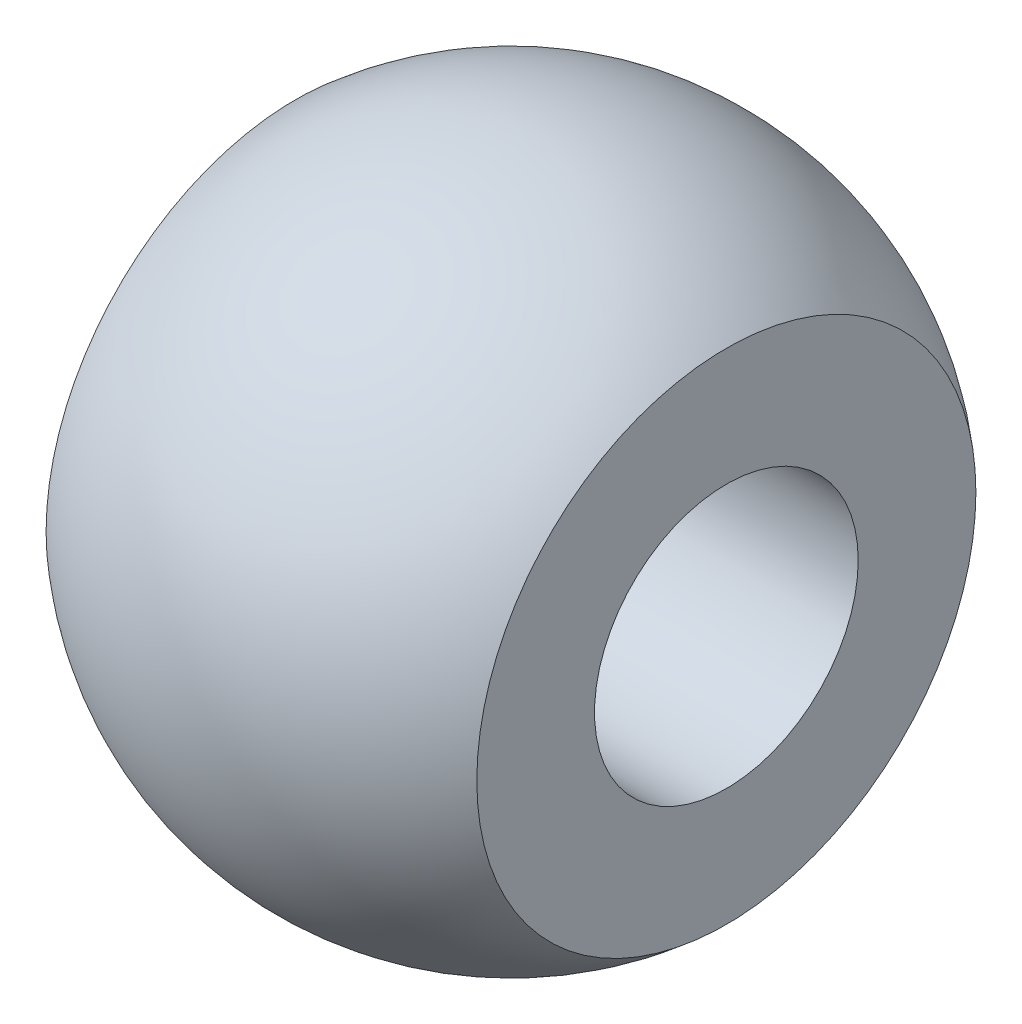
ISO-10303-21;
HEADER;
FILE_DESCRIPTION(('STEP AP214'),'2;1');
FILE_NAME('part.step','',(''),(''),'','','');
FILE_SCHEMA(('AUTOMOTIVE_DESIGN { 1 0 10303 214 1 1 1 1 }'));
ENDSEC;
DATA;
#1=APPLICATION_CONTEXT('core data for automotive mechanical design processes');
#2=APPLICATION_PROTOCOL_DEFINITION('international standard','automotive_design',2000,#1);
#3=PRODUCT_CONTEXT('',#1,'mechanical');
#4=PRODUCT('Part','Part','',(#3));
#5=PRODUCT_RELATED_PRODUCT_CATEGORY('part','',(#4));
#6=PRODUCT_DEFINITION_FORMATION('','',#4);
#7=PRODUCT_DEFINITION_CONTEXT('part definition',#1,'design');
#8=PRODUCT_DEFINITION('design','',#6,#7);
#9=PRODUCT_DEFINITION_SHAPE('','',#8);
#10=(LENGTH_UNIT() NAMED_UNIT(*) SI_UNIT(.MILLI.,.METRE.));
#11=(NAMED_UNIT(*) PLANE_ANGLE_UNIT() SI_UNIT($,.RADIAN.));
#12=(NAMED_UNIT(*) SI_UNIT($,.STERADIAN.) SOLID_ANGLE_UNIT());
#13=UNCERTAINTY_MEASURE_WITH_UNIT(LENGTH_MEASURE(1.E-05),#10,'distance_accuracy_value','');
#14=(GEOMETRIC_REPRESENTATION_CONTEXT(3) GLOBAL_UNCERTAINTY_ASSIGNED_CONTEXT((#13)) GLOBAL_UNIT_ASSIGNED_CONTEXT((#10,
#11,#12)) REPRESENTATION_CONTEXT('',''));
#15=CARTESIAN_POINT('',(0.,0.,0.));
#16=DIRECTION('',(0.,0.,1.));
#17=DIRECTION('',(1.,0.,0.));
#18=AXIS2_PLACEMENT_3D('',#15,#16,#17);
#19=CARTESIAN_POINT('',(0.,0.,0.));
#20=DIRECTION('',(0.,0.406046159553988,0.913852568148417));
#21=DIRECTION('',(0.,-0.913852568148417,0.406046159553988));
#22=AXIS2_PLACEMENT_3D('',#19,#20,#21);
#23=SPHERICAL_SURFACE('',#22,3.75);
#24=CARTESIAN_POINT('',(0.,0.,0.));
#25=DIRECTION('',(1.,0.,0.));
#26=DIRECTION('',(0.,0.,-1.));
#27=AXIS2_PLACEMENT_3D('',#24,#25,#26);
#28=SPHERICAL_SURFACE('',#27,3.75);
#29=CARTESIAN_POINT('',(-2.45,0.,0.));
#30=DIRECTION('',(1.,0.,0.));
#31=DIRECTION('',(0.,0.,-1.));
#32=AXIS2_PLACEMENT_3D('',#29,#30,#31);
#33=CIRCLE('',#32,2.83901391331568);
#34=CARTESIAN_POINT('',(-2.45,0.,-2.83901391331568));
#35=VERTEX_POINT('',#34);
#36=EDGE_CURVE('E10',#35,#35,#33,.F.);
#37=ORIENTED_EDGE('',*,*,#36,.F.);
#38=EDGE_LOOP('',(#37));
#39=FACE_BOUND('',#38,.T.);
#40=CARTESIAN_POINT('',(2.45,0.,0.));
#41=DIRECTION('',(-1.,0.,0.));
#42=DIRECTION('',(0.,0.,1.));
#43=AXIS2_PLACEMENT_3D('',#40,#41,#42);
#44=CIRCLE('',#43,2.83901391331568);
#45=CARTESIAN_POINT('',(2.45,0.,2.83901391331568));
#46=VERTEX_POINT('',#45);
#47=EDGE_CURVE('E40',#46,#46,#44,.F.);
#48=ORIENTED_EDGE('',*,*,#47,.F.);
#49=EDGE_LOOP('',(#48));
#50=FACE_BOUND('',#49,.T.);
#51=ADVANCED_FACE('F34',(#39,#50),#28,.T.);
#52=CARTESIAN_POINT('',(2.45,-3.75,-4.98638470191226));
#53=DIRECTION('',(-1.,0.,0.));
#54=DIRECTION('',(0.,0.,1.));
#55=AXIS2_PLACEMENT_3D('',#52,#53,#54);
#56=PLANE('',#55);
#57=CARTESIAN_POINT('',(2.45,0.,0.));
#58=DIRECTION('',(1.,0.,0.));
#59=DIRECTION('',(0.,0.,-1.));
#60=AXIS2_PLACEMENT_3D('',#57,#58,#59);
#61=CIRCLE('',#60,1.5);
#62=CARTESIAN_POINT('',(2.45,0.,-1.5));
#63=VERTEX_POINT('',#62);
#64=EDGE_CURVE('E48',#63,#63,#61,.T.);
#65=ORIENTED_EDGE('',*,*,#64,.F.);
#66=EDGE_LOOP('',(#65));
#67=FACE_BOUND('',#66,.T.);
#68=ORIENTED_EDGE('',*,*,#47,.T.);
#69=EDGE_LOOP('',(#68));
#70=FACE_BOUND('',#69,.T.);
#71=ADVANCED_FACE('F56',(#67,#70),#56,.F.);
#72=CARTESIAN_POINT('',(-2.45,-3.75,-4.98638470191226));
#73=DIRECTION('',(1.,0.,0.));
#74=DIRECTION('',(0.,0.,-1.));
#75=AXIS2_PLACEMENT_3D('',#72,#73,#74);
#76=PLANE('',#75);
#77=CARTESIAN_POINT('',(-2.45,0.,0.));
#78=DIRECTION('',(1.,0.,0.));
#79=DIRECTION('',(0.,0.,-1.));
#80=AXIS2_PLACEMENT_3D('',#77,#78,#79);
#81=CIRCLE('',#80,1.5);
#82=CARTESIAN_POINT('',(-2.45,0.,-1.5));
#83=VERTEX_POINT('',#82);
#84=EDGE_CURVE('E44',#83,#83,#81,.F.);
#85=ORIENTED_EDGE('',*,*,#84,.F.);
#86=EDGE_LOOP('',(#85));
#87=FACE_BOUND('',#86,.T.);
#88=ORIENTED_EDGE('',*,*,#36,.T.);
#89=EDGE_LOOP('',(#88));
#90=FACE_BOUND('',#89,.T.);
#91=ADVANCED_FACE('F58',(#87,#90),#76,.F.);
#92=CARTESIAN_POINT('',(-6.69264068711928,0.,0.));
#93=DIRECTION('',(1.,0.,0.));
#94=DIRECTION('',(0.,0.,-1.));
#95=AXIS2_PLACEMENT_3D('',#92,#93,#94);
#96=CYLINDRICAL_SURFACE('',#95,1.5);
#97=ORIENTED_EDGE('',*,*,#84,.T.);
#98=EDGE_LOOP('',(#97));
#99=FACE_BOUND('',#98,.T.);
#100=ORIENTED_EDGE('',*,*,#64,.T.);
#101=EDGE_LOOP('',(#100));
#102=FACE_BOUND('',#101,.T.);
#103=ADVANCED_FACE('F54',(#99,#102),#96,.F.);
#104=CLOSED_SHELL('',(#51,#71,#91,#103));
#105=MANIFOLD_SOLID_BREP('B2',#104);
#106=ADVANCED_BREP_SHAPE_REPRESENTATION('',(#18,#105),#14);
#107=SHAPE_DEFINITION_REPRESENTATION(#9,#106);
ENDSEC;
END-ISO-10303-21;
